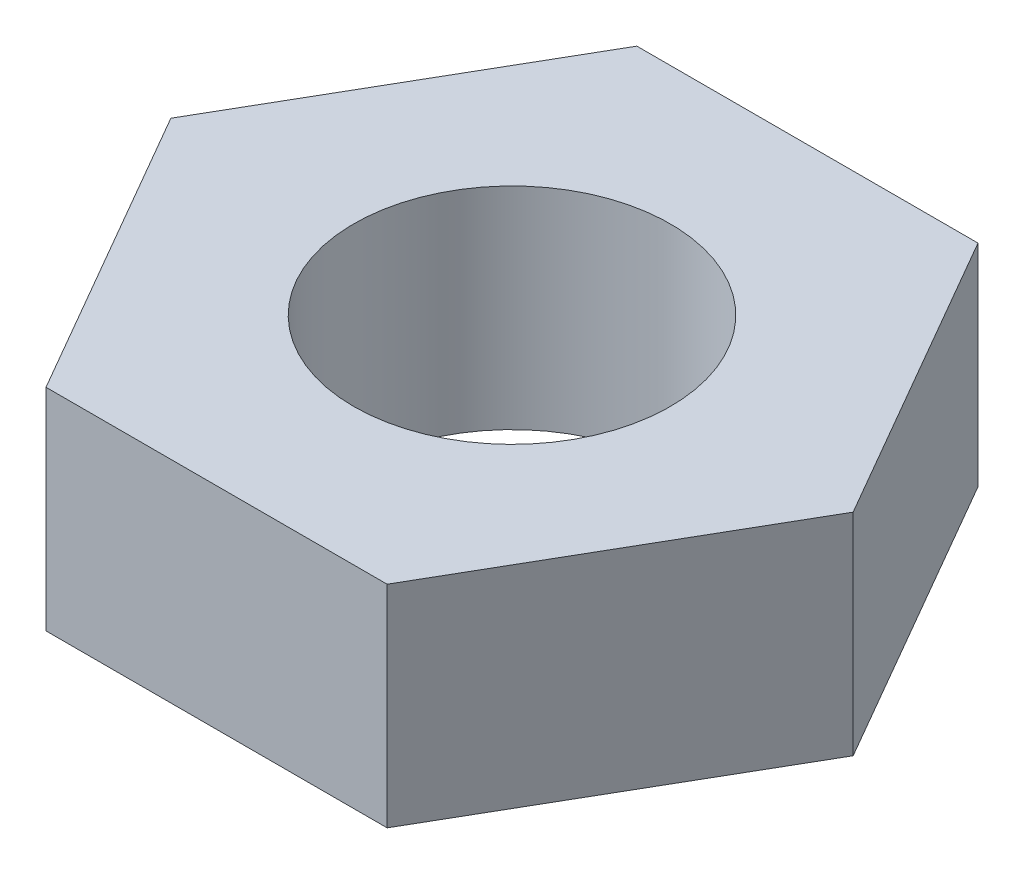
ISO-10303-21;
HEADER;
FILE_DESCRIPTION(('STEP AP214'),'2;1');
FILE_NAME('part.step','',(''),(''),'','','');
FILE_SCHEMA(('AUTOMOTIVE_DESIGN { 1 0 10303 214 1 1 1 1 }'));
ENDSEC;
DATA;
#1=APPLICATION_CONTEXT('core data for automotive mechanical design processes');
#2=APPLICATION_PROTOCOL_DEFINITION('international standard','automotive_design',2000,#1);
#3=PRODUCT_CONTEXT('',#1,'mechanical');
#4=PRODUCT('Part','Part','',(#3));
#5=PRODUCT_RELATED_PRODUCT_CATEGORY('part','',(#4));
#6=PRODUCT_DEFINITION_FORMATION('','',#4);
#7=PRODUCT_DEFINITION_CONTEXT('part definition',#1,'design');
#8=PRODUCT_DEFINITION('design','',#6,#7);
#9=PRODUCT_DEFINITION_SHAPE('','',#8);
#10=(LENGTH_UNIT() NAMED_UNIT(*) SI_UNIT(.MILLI.,.METRE.));
#11=(NAMED_UNIT(*) PLANE_ANGLE_UNIT() SI_UNIT($,.RADIAN.));
#12=(NAMED_UNIT(*) SI_UNIT($,.STERADIAN.) SOLID_ANGLE_UNIT());
#13=UNCERTAINTY_MEASURE_WITH_UNIT(LENGTH_MEASURE(1.E-05),#10,'distance_accuracy_value','');
#14=(GEOMETRIC_REPRESENTATION_CONTEXT(3) GLOBAL_UNCERTAINTY_ASSIGNED_CONTEXT((#13)) GLOBAL_UNIT_ASSIGNED_CONTEXT((#10,
#11,#12)) REPRESENTATION_CONTEXT('',''));
#15=CARTESIAN_POINT('',(0.,0.,0.));
#16=DIRECTION('',(0.,0.,1.));
#17=DIRECTION('',(1.,0.,0.));
#18=AXIS2_PLACEMENT_3D('',#15,#16,#17);
#19=CARTESIAN_POINT('',(4.10611511447662,-2.54,0.));
#20=DIRECTION('',(0.866025403784439,0.,-0.5));
#21=DIRECTION('',(-0.5,0.,-0.866025403784439));
#22=AXIS2_PLACEMENT_3D('',#19,#20,#21);
#23=PLANE('',#22);
#24=DIRECTION('',(-0.5,0.,-0.866025403784439));
#25=VECTOR('',#24,1.);
#26=CARTESIAN_POINT('',(4.10611511447662,0.,0.));
#27=LINE('',#26,#25);
#28=CARTESIAN_POINT('',(4.10611511447662,0.,0.));
#29=VERTEX_POINT('',#28);
#30=CARTESIAN_POINT('',(2.05305755723831,0.,-3.556));
#31=VERTEX_POINT('',#30);
#32=EDGE_CURVE('E115',#29,#31,#27,.T.);
#33=ORIENTED_EDGE('',*,*,#32,.F.);
#34=DIRECTION('',(0.,1.,0.));
#35=VECTOR('',#34,1.);
#36=CARTESIAN_POINT('',(4.10611511447662,-2.54,0.));
#37=LINE('',#36,#35);
#38=CARTESIAN_POINT('',(4.10611511447662,-2.54,0.));
#39=VERTEX_POINT('',#38);
#40=EDGE_CURVE('E11',#39,#29,#37,.T.);
#41=ORIENTED_EDGE('',*,*,#40,.F.);
#42=DIRECTION('',(-0.5,0.,-0.866025403784439));
#43=VECTOR('',#42,1.);
#44=CARTESIAN_POINT('',(4.10611511447662,-2.54,0.));
#45=LINE('',#44,#43);
#46=CARTESIAN_POINT('',(2.05305755723831,-2.54,-3.55600000000001));
#47=VERTEX_POINT('',#46);
#48=EDGE_CURVE('E130',#39,#47,#45,.T.);
#49=ORIENTED_EDGE('',*,*,#48,.T.);
#50=DIRECTION('',(0.,1.,0.));
#51=VECTOR('',#50,1.);
#52=CARTESIAN_POINT('',(2.05305755723831,-2.54,-3.55600000000001));
#53=LINE('',#52,#51);
#54=EDGE_CURVE('E33',#47,#31,#53,.T.);
#55=ORIENTED_EDGE('',*,*,#54,.T.);
#56=EDGE_LOOP('',(#33,#41,#49,#55));
#57=FACE_BOUND('',#56,.T.);
#58=ADVANCED_FACE('F30',(#57),#23,.T.);
#59=CARTESIAN_POINT('',(2.05305755723831,-2.54,3.556));
#60=DIRECTION('',(0.866025403784439,0.,0.5));
#61=DIRECTION('',(0.5,0.,-0.866025403784439));
#62=AXIS2_PLACEMENT_3D('',#59,#60,#61);
#63=PLANE('',#62);
#64=DIRECTION('',(0.5,0.,-0.866025403784439));
#65=VECTOR('',#64,1.);
#66=CARTESIAN_POINT('',(2.05305755723831,0.,3.556));
#67=LINE('',#66,#65);
#68=CARTESIAN_POINT('',(2.05305755723831,0.,3.556));
#69=VERTEX_POINT('',#68);
#70=EDGE_CURVE('E128',#69,#29,#67,.T.);
#71=ORIENTED_EDGE('',*,*,#70,.F.);
#72=DIRECTION('',(0.,1.,0.));
#73=VECTOR('',#72,1.);
#74=CARTESIAN_POINT('',(2.05305755723831,-2.54,3.556));
#75=LINE('',#74,#73);
#76=CARTESIAN_POINT('',(2.05305755723831,-2.54,3.556));
#77=VERTEX_POINT('',#76);
#78=EDGE_CURVE('E39',#77,#69,#75,.T.);
#79=ORIENTED_EDGE('',*,*,#78,.F.);
#80=DIRECTION('',(0.5,0.,-0.866025403784439));
#81=VECTOR('',#80,1.);
#82=CARTESIAN_POINT('',(2.05305755723831,-2.54,3.556));
#83=LINE('',#82,#81);
#84=EDGE_CURVE('E105',#77,#39,#83,.T.);
#85=ORIENTED_EDGE('',*,*,#84,.T.);
#86=ORIENTED_EDGE('',*,*,#40,.T.);
#87=EDGE_LOOP('',(#71,#79,#85,#86));
#88=FACE_BOUND('',#87,.T.);
#89=ADVANCED_FACE('F138',(#88),#63,.T.);
#90=CARTESIAN_POINT('',(-2.05305755723831,-2.54,3.556));
#91=DIRECTION('',(0.,0.,1.));
#92=DIRECTION('',(1.,0.,0.));
#93=AXIS2_PLACEMENT_3D('',#90,#91,#92);
#94=PLANE('',#93);
#95=DIRECTION('',(1.,0.,0.));
#96=VECTOR('',#95,1.);
#97=CARTESIAN_POINT('',(-2.05305755723831,0.,3.556));
#98=LINE('',#97,#96);
#99=CARTESIAN_POINT('',(-2.05305755723831,0.,3.556));
#100=VERTEX_POINT('',#99);
#101=EDGE_CURVE('E92',#100,#69,#98,.T.);
#102=ORIENTED_EDGE('',*,*,#101,.F.);
#103=DIRECTION('',(0.,1.,0.));
#104=VECTOR('',#103,1.);
#105=CARTESIAN_POINT('',(-2.05305755723831,-2.54,3.556));
#106=LINE('',#105,#104);
#107=CARTESIAN_POINT('',(-2.05305755723831,-2.54,3.556));
#108=VERTEX_POINT('',#107);
#109=EDGE_CURVE('E87',#108,#100,#106,.T.);
#110=ORIENTED_EDGE('',*,*,#109,.F.);
#111=DIRECTION('',(1.,0.,0.));
#112=VECTOR('',#111,1.);
#113=CARTESIAN_POINT('',(-2.05305755723831,-2.54,3.556));
#114=LINE('',#113,#112);
#115=EDGE_CURVE('E90',#108,#77,#114,.T.);
#116=ORIENTED_EDGE('',*,*,#115,.T.);
#117=ORIENTED_EDGE('',*,*,#78,.T.);
#118=EDGE_LOOP('',(#102,#110,#116,#117));
#119=FACE_BOUND('',#118,.T.);
#120=ADVANCED_FACE('F89',(#119),#94,.T.);
#121=CARTESIAN_POINT('',(-4.10611511447662,-2.54,0.));
#122=DIRECTION('',(-0.866025403784439,0.,0.5));
#123=DIRECTION('',(0.5,0.,0.866025403784439));
#124=AXIS2_PLACEMENT_3D('',#121,#122,#123);
#125=PLANE('',#124);
#126=DIRECTION('',(0.5,0.,0.866025403784439));
#127=VECTOR('',#126,1.);
#128=CARTESIAN_POINT('',(-4.10611511447662,0.,0.));
#129=LINE('',#128,#127);
#130=CARTESIAN_POINT('',(-4.10611511447662,0.,0.));
#131=VERTEX_POINT('',#130);
#132=EDGE_CURVE('E125',#131,#100,#129,.T.);
#133=ORIENTED_EDGE('',*,*,#132,.F.);
#134=DIRECTION('',(0.,1.,0.));
#135=VECTOR('',#134,1.);
#136=CARTESIAN_POINT('',(-4.10611511447662,-2.54,0.));
#137=LINE('',#136,#135);
#138=CARTESIAN_POINT('',(-4.10611511447662,-2.54,0.));
#139=VERTEX_POINT('',#138);
#140=EDGE_CURVE('E97',#139,#131,#137,.T.);
#141=ORIENTED_EDGE('',*,*,#140,.F.);
#142=DIRECTION('',(0.5,0.,0.866025403784439));
#143=VECTOR('',#142,1.);
#144=CARTESIAN_POINT('',(-4.10611511447662,-2.54,0.));
#145=LINE('',#144,#143);
#146=EDGE_CURVE('E103',#139,#108,#145,.T.);
#147=ORIENTED_EDGE('',*,*,#146,.T.);
#148=ORIENTED_EDGE('',*,*,#109,.T.);
#149=EDGE_LOOP('',(#133,#141,#147,#148));
#150=FACE_BOUND('',#149,.T.);
#151=ADVANCED_FACE('F107',(#150),#125,.T.);
#152=CARTESIAN_POINT('',(-2.05305755723831,-2.54,-3.55600000000001));
#153=DIRECTION('',(-0.866025403784439,0.,-0.5));
#154=DIRECTION('',(-0.5,0.,0.866025403784439));
#155=AXIS2_PLACEMENT_3D('',#152,#153,#154);
#156=PLANE('',#155);
#157=DIRECTION('',(-0.5,0.,0.866025403784439));
#158=VECTOR('',#157,1.);
#159=CARTESIAN_POINT('',(-2.05305755723831,0.,-3.556));
#160=LINE('',#159,#158);
#161=CARTESIAN_POINT('',(-2.05305755723831,0.,-3.556));
#162=VERTEX_POINT('',#161);
#163=EDGE_CURVE('E122',#162,#131,#160,.T.);
#164=ORIENTED_EDGE('',*,*,#163,.F.);
#165=DIRECTION('',(0.,1.,0.));
#166=VECTOR('',#165,1.);
#167=CARTESIAN_POINT('',(-2.05305755723831,-2.54,-3.55600000000001));
#168=LINE('',#167,#166);
#169=CARTESIAN_POINT('',(-2.05305755723831,-2.54,-3.55600000000001));
#170=VERTEX_POINT('',#169);
#171=EDGE_CURVE('E133',#170,#162,#168,.T.);
#172=ORIENTED_EDGE('',*,*,#171,.F.);
#173=DIRECTION('',(-0.5,0.,0.866025403784439));
#174=VECTOR('',#173,1.);
#175=CARTESIAN_POINT('',(-2.05305755723831,-2.54,-3.55600000000001));
#176=LINE('',#175,#174);
#177=EDGE_CURVE('E108',#170,#139,#176,.T.);
#178=ORIENTED_EDGE('',*,*,#177,.T.);
#179=ORIENTED_EDGE('',*,*,#140,.T.);
#180=EDGE_LOOP('',(#164,#172,#178,#179));
#181=FACE_BOUND('',#180,.T.);
#182=ADVANCED_FACE('F151',(#181),#156,.T.);
#183=CARTESIAN_POINT('',(2.05305755723831,-2.54,-3.55600000000001));
#184=DIRECTION('',(0.,0.,-1.));
#185=DIRECTION('',(-1.,0.,0.));
#186=AXIS2_PLACEMENT_3D('',#183,#184,#185);
#187=PLANE('',#186);
#188=DIRECTION('',(-1.,0.,0.));
#189=VECTOR('',#188,1.);
#190=CARTESIAN_POINT('',(2.05305755723831,0.,-3.556));
#191=LINE('',#190,#189);
#192=EDGE_CURVE('E118',#31,#162,#191,.T.);
#193=ORIENTED_EDGE('',*,*,#192,.F.);
#194=ORIENTED_EDGE('',*,*,#54,.F.);
#195=DIRECTION('',(-1.,0.,0.));
#196=VECTOR('',#195,1.);
#197=CARTESIAN_POINT('',(2.05305755723831,-2.54,-3.55600000000001));
#198=LINE('',#197,#196);
#199=EDGE_CURVE('E110',#47,#170,#198,.T.);
#200=ORIENTED_EDGE('',*,*,#199,.T.);
#201=ORIENTED_EDGE('',*,*,#171,.T.);
#202=EDGE_LOOP('',(#193,#194,#200,#201));
#203=FACE_BOUND('',#202,.T.);
#204=ADVANCED_FACE('F135',(#203),#187,.T.);
#205=CARTESIAN_POINT('',(0.,-2.54,0.));
#206=DIRECTION('',(0.,1.,0.));
#207=DIRECTION('',(0.,0.,1.));
#208=AXIS2_PLACEMENT_3D('',#205,#206,#207);
#209=PLANE('',#208);
#210=CARTESIAN_POINT('',(0.,-2.54,0.));
#211=DIRECTION('',(0.,1.,0.));
#212=DIRECTION('',(0.,0.,1.));
#213=AXIS2_PLACEMENT_3D('',#210,#211,#212);
#214=CIRCLE('',#213,1.905);
#215=CARTESIAN_POINT('',(0.,-2.54,1.905));
#216=VERTEX_POINT('',#215);
#217=EDGE_CURVE('E119',#216,#216,#214,.T.);
#218=ORIENTED_EDGE('',*,*,#217,.T.);
#219=EDGE_LOOP('',(#218));
#220=FACE_BOUND('',#219,.T.);
#221=ORIENTED_EDGE('',*,*,#48,.F.);
#222=ORIENTED_EDGE('',*,*,#84,.F.);
#223=ORIENTED_EDGE('',*,*,#115,.F.);
#224=ORIENTED_EDGE('',*,*,#146,.F.);
#225=ORIENTED_EDGE('',*,*,#177,.F.);
#226=ORIENTED_EDGE('',*,*,#199,.F.);
#227=EDGE_LOOP('',(#221,#222,#223,#224,#225,#226));
#228=FACE_BOUND('',#227,.T.);
#229=ADVANCED_FACE('F101',(#220,#228),#209,.F.);
#230=CARTESIAN_POINT('',(0.,0.,0.));
#231=DIRECTION('',(0.,1.,0.));
#232=DIRECTION('',(0.,0.,1.));
#233=AXIS2_PLACEMENT_3D('',#230,#231,#232);
#234=PLANE('',#233);
#235=CARTESIAN_POINT('',(0.,0.,0.));
#236=DIRECTION('',(0.,1.,0.));
#237=DIRECTION('',(0.,0.,1.));
#238=AXIS2_PLACEMENT_3D('',#235,#236,#237);
#239=CIRCLE('',#238,1.905);
#240=CARTESIAN_POINT('',(0.,0.,1.905));
#241=VERTEX_POINT('',#240);
#242=EDGE_CURVE('E174',#241,#241,#239,.T.);
#243=ORIENTED_EDGE('',*,*,#242,.F.);
#244=EDGE_LOOP('',(#243));
#245=FACE_BOUND('',#244,.T.);
#246=ORIENTED_EDGE('',*,*,#32,.T.);
#247=ORIENTED_EDGE('',*,*,#192,.T.);
#248=ORIENTED_EDGE('',*,*,#163,.T.);
#249=ORIENTED_EDGE('',*,*,#132,.T.);
#250=ORIENTED_EDGE('',*,*,#101,.T.);
#251=ORIENTED_EDGE('',*,*,#70,.T.);
#252=EDGE_LOOP('',(#246,#247,#248,#249,#250,#251));
#253=FACE_BOUND('',#252,.T.);
#254=ADVANCED_FACE('F137',(#245,#253),#234,.T.);
#255=CARTESIAN_POINT('',(0.,-2.54,0.));
#256=DIRECTION('',(0.,1.,0.));
#257=DIRECTION('',(0.,0.,1.));
#258=AXIS2_PLACEMENT_3D('',#255,#256,#257);
#259=CYLINDRICAL_SURFACE('',#258,1.905);
#260=ORIENTED_EDGE('',*,*,#217,.F.);
#261=EDGE_LOOP('',(#260));
#262=FACE_BOUND('',#261,.T.);
#263=ORIENTED_EDGE('',*,*,#242,.T.);
#264=EDGE_LOOP('',(#263));
#265=FACE_BOUND('',#264,.T.);
#266=ADVANCED_FACE('F162',(#262,#265),#259,.F.);
#267=CLOSED_SHELL('',(#58,#89,#120,#151,#182,#204,#229,#254,#266));
#268=MANIFOLD_SOLID_BREP('B2',#267);
#269=ADVANCED_BREP_SHAPE_REPRESENTATION('',(#18,#268),#14);
#270=SHAPE_DEFINITION_REPRESENTATION(#9,#269);
ENDSEC;
END-ISO-10303-21;
